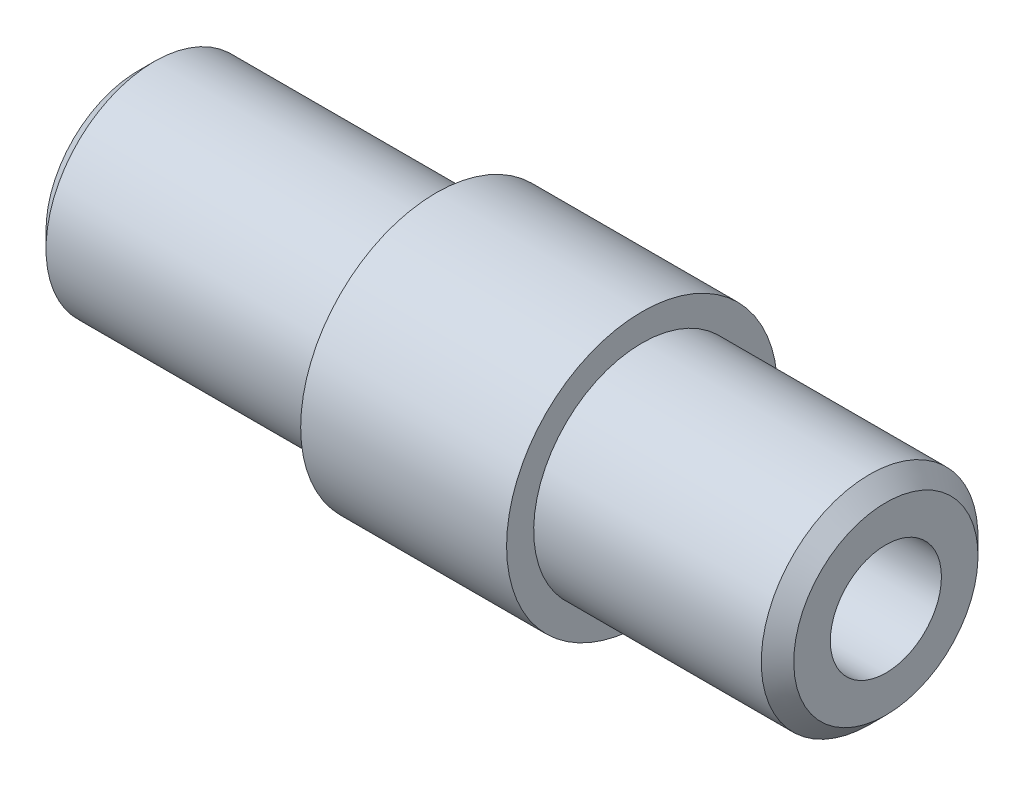
ISO-10303-21;
HEADER;
FILE_DESCRIPTION(('STEP AP214'),'2;1');
FILE_NAME('part.step','',(''),(''),'','','');
FILE_SCHEMA(('AUTOMOTIVE_DESIGN { 1 0 10303 214 1 1 1 1 }'));
ENDSEC;
DATA;
#1=APPLICATION_CONTEXT('core data for automotive mechanical design processes');
#2=APPLICATION_PROTOCOL_DEFINITION('international standard','automotive_design',2000,#1);
#3=PRODUCT_CONTEXT('',#1,'mechanical');
#4=PRODUCT('Part','Part','',(#3));
#5=PRODUCT_RELATED_PRODUCT_CATEGORY('part','',(#4));
#6=PRODUCT_DEFINITION_FORMATION('','',#4);
#7=PRODUCT_DEFINITION_CONTEXT('part definition',#1,'design');
#8=PRODUCT_DEFINITION('design','',#6,#7);
#9=PRODUCT_DEFINITION_SHAPE('','',#8);
#10=(LENGTH_UNIT() NAMED_UNIT(*) SI_UNIT(.MILLI.,.METRE.));
#11=(NAMED_UNIT(*) PLANE_ANGLE_UNIT() SI_UNIT($,.RADIAN.));
#12=(NAMED_UNIT(*) SI_UNIT($,.STERADIAN.) SOLID_ANGLE_UNIT());
#13=UNCERTAINTY_MEASURE_WITH_UNIT(LENGTH_MEASURE(1.E-05),#10,'distance_accuracy_value','');
#14=(GEOMETRIC_REPRESENTATION_CONTEXT(3) GLOBAL_UNCERTAINTY_ASSIGNED_CONTEXT((#13)) GLOBAL_UNIT_ASSIGNED_CONTEXT((#10,
#11,#12)) REPRESENTATION_CONTEXT('',''));
#15=CARTESIAN_POINT('',(0.,0.,0.));
#16=DIRECTION('',(0.,0.,1.));
#17=DIRECTION('',(1.,0.,0.));
#18=AXIS2_PLACEMENT_3D('',#15,#16,#17);
#19=CARTESIAN_POINT('',(13.8,0.,0.));
#20=DIRECTION('',(1.,0.,0.));
#21=DIRECTION('',(0.,1.,0.));
#22=AXIS2_PLACEMENT_3D('',#19,#20,#21);
#23=PLANE('',#22);
#24=CARTESIAN_POINT('',(13.8,0.,0.));
#25=DIRECTION('',(1.,0.,0.));
#26=DIRECTION('',(0.,1.,0.));
#27=AXIS2_PLACEMENT_3D('',#24,#25,#26);
#28=CIRCLE('',#27,1.69999999999999);
#29=CARTESIAN_POINT('',(13.8,-1.69999999999999,0.));
#30=VERTEX_POINT('',#29);
#31=EDGE_CURVE('E51',#30,#30,#28,.T.);
#32=ORIENTED_EDGE('',*,*,#31,.T.);
#33=EDGE_LOOP('',(#32));
#34=FACE_BOUND('',#33,.T.);
#35=CARTESIAN_POINT('',(13.8,0.,0.));
#36=DIRECTION('',(1.,0.,0.));
#37=DIRECTION('',(0.,0.,-1.));
#38=AXIS2_PLACEMENT_3D('',#35,#36,#37);
#39=CIRCLE('',#38,1.02499999999999);
#40=CARTESIAN_POINT('',(13.8,0.,-1.02499999999999));
#41=VERTEX_POINT('',#40);
#42=EDGE_CURVE('E71',#41,#41,#39,.T.);
#43=ORIENTED_EDGE('',*,*,#42,.F.);
#44=EDGE_LOOP('',(#43));
#45=FACE_BOUND('',#44,.T.);
#46=ADVANCED_FACE('F36',(#34,#45),#23,.T.);
#47=CARTESIAN_POINT('',(13.8,0.,0.));
#48=DIRECTION('',(1.,0.,0.));
#49=DIRECTION('',(0.,1.,0.));
#50=AXIS2_PLACEMENT_3D('',#47,#48,#49);
#51=CYLINDRICAL_SURFACE('',#50,2.);
#52=CARTESIAN_POINT('',(13.5,0.,0.));
#53=DIRECTION('',(1.,0.,0.));
#54=DIRECTION('',(0.,1.,0.));
#55=AXIS2_PLACEMENT_3D('',#52,#53,#54);
#56=CIRCLE('',#55,2.);
#57=CARTESIAN_POINT('',(13.5,-1.99999999999999,0.));
#58=VERTEX_POINT('',#57);
#59=EDGE_CURVE('E47',#58,#58,#56,.F.);
#60=ORIENTED_EDGE('',*,*,#59,.T.);
#61=EDGE_LOOP('',(#60));
#62=FACE_BOUND('',#61,.T.);
#63=CARTESIAN_POINT('',(9.3,0.,0.));
#64=DIRECTION('',(1.,0.,0.));
#65=DIRECTION('',(0.,1.,0.));
#66=AXIS2_PLACEMENT_3D('',#63,#64,#65);
#67=CIRCLE('',#66,2.);
#68=CARTESIAN_POINT('',(9.3,2.,0.));
#69=VERTEX_POINT('',#68);
#70=EDGE_CURVE('E56',#69,#69,#67,.T.);
#71=ORIENTED_EDGE('',*,*,#70,.T.);
#72=EDGE_LOOP('',(#71));
#73=FACE_BOUND('',#72,.T.);
#74=ADVANCED_FACE('F78',(#62,#73),#51,.T.);
#75=CARTESIAN_POINT('',(9.3,2.5,0.));
#76=DIRECTION('',(1.,0.,0.));
#77=DIRECTION('',(0.,1.,0.));
#78=AXIS2_PLACEMENT_3D('',#75,#76,#77);
#79=PLANE('',#78);
#80=CARTESIAN_POINT('',(9.3,0.,0.));
#81=DIRECTION('',(1.,0.,0.));
#82=DIRECTION('',(0.,1.,0.));
#83=AXIS2_PLACEMENT_3D('',#80,#81,#82);
#84=CIRCLE('',#83,2.5);
#85=CARTESIAN_POINT('',(9.3,2.5,0.));
#86=VERTEX_POINT('',#85);
#87=EDGE_CURVE('E59',#86,#86,#84,.T.);
#88=ORIENTED_EDGE('',*,*,#87,.T.);
#89=EDGE_LOOP('',(#88));
#90=FACE_BOUND('',#89,.T.);
#91=ORIENTED_EDGE('',*,*,#70,.F.);
#92=EDGE_LOOP('',(#91));
#93=FACE_BOUND('',#92,.T.);
#94=ADVANCED_FACE('F84',(#90,#93),#79,.T.);
#95=CARTESIAN_POINT('',(13.8,0.,0.));
#96=DIRECTION('',(1.,0.,0.));
#97=DIRECTION('',(0.,1.,0.));
#98=AXIS2_PLACEMENT_3D('',#95,#96,#97);
#99=CYLINDRICAL_SURFACE('',#98,2.5);
#100=CARTESIAN_POINT('',(5.5,0.,0.));
#101=DIRECTION('',(1.,0.,0.));
#102=DIRECTION('',(0.,1.,0.));
#103=AXIS2_PLACEMENT_3D('',#100,#101,#102);
#104=CIRCLE('',#103,2.5);
#105=CARTESIAN_POINT('',(5.5,2.5,0.));
#106=VERTEX_POINT('',#105);
#107=EDGE_CURVE('E62',#106,#106,#104,.T.);
#108=ORIENTED_EDGE('',*,*,#107,.T.);
#109=EDGE_LOOP('',(#108));
#110=FACE_BOUND('',#109,.T.);
#111=ORIENTED_EDGE('',*,*,#87,.F.);
#112=EDGE_LOOP('',(#111));
#113=FACE_BOUND('',#112,.T.);
#114=ADVANCED_FACE('F106',(#110,#113),#99,.T.);
#115=CARTESIAN_POINT('',(5.5,2.,0.));
#116=DIRECTION('',(-1.,0.,0.));
#117=DIRECTION('',(0.,-1.,0.));
#118=AXIS2_PLACEMENT_3D('',#115,#116,#117);
#119=PLANE('',#118);
#120=CARTESIAN_POINT('',(5.5,0.,0.));
#121=DIRECTION('',(1.,0.,0.));
#122=DIRECTION('',(0.,1.,0.));
#123=AXIS2_PLACEMENT_3D('',#120,#121,#122);
#124=CIRCLE('',#123,2.);
#125=CARTESIAN_POINT('',(5.5,2.,0.));
#126=VERTEX_POINT('',#125);
#127=EDGE_CURVE('E65',#126,#126,#124,.T.);
#128=ORIENTED_EDGE('',*,*,#127,.T.);
#129=EDGE_LOOP('',(#128));
#130=FACE_BOUND('',#129,.T.);
#131=ORIENTED_EDGE('',*,*,#107,.F.);
#132=EDGE_LOOP('',(#131));
#133=FACE_BOUND('',#132,.T.);
#134=ADVANCED_FACE('F111',(#130,#133),#119,.T.);
#135=CARTESIAN_POINT('',(13.8,0.,0.));
#136=DIRECTION('',(1.,0.,0.));
#137=DIRECTION('',(0.,1.,0.));
#138=AXIS2_PLACEMENT_3D('',#135,#136,#137);
#139=CYLINDRICAL_SURFACE('',#138,2.);
#140=CARTESIAN_POINT('',(0.3,0.,0.));
#141=DIRECTION('',(-1.,0.,0.));
#142=DIRECTION('',(0.,-1.,0.));
#143=AXIS2_PLACEMENT_3D('',#140,#141,#142);
#144=CIRCLE('',#143,2.);
#145=CARTESIAN_POINT('',(0.3,-2.,0.));
#146=VERTEX_POINT('',#145);
#147=EDGE_CURVE('E43',#146,#146,#144,.F.);
#148=ORIENTED_EDGE('',*,*,#147,.T.);
#149=EDGE_LOOP('',(#148));
#150=FACE_BOUND('',#149,.T.);
#151=ORIENTED_EDGE('',*,*,#127,.F.);
#152=EDGE_LOOP('',(#151));
#153=FACE_BOUND('',#152,.T.);
#154=ADVANCED_FACE('F117',(#150,#153),#139,.T.);
#155=CARTESIAN_POINT('',(0.,0.,0.));
#156=DIRECTION('',(-1.,0.,0.));
#157=DIRECTION('',(0.,-1.,0.));
#158=AXIS2_PLACEMENT_3D('',#155,#156,#157);
#159=PLANE('',#158);
#160=CARTESIAN_POINT('',(0.,0.,0.));
#161=DIRECTION('',(-1.,0.,0.));
#162=DIRECTION('',(0.,-1.,0.));
#163=AXIS2_PLACEMENT_3D('',#160,#161,#162);
#164=CIRCLE('',#163,1.7);
#165=CARTESIAN_POINT('',(0.,-1.7,0.));
#166=VERTEX_POINT('',#165);
#167=EDGE_CURVE('E10',#166,#166,#164,.T.);
#168=ORIENTED_EDGE('',*,*,#167,.T.);
#169=EDGE_LOOP('',(#168));
#170=FACE_BOUND('',#169,.T.);
#171=CARTESIAN_POINT('',(0.,0.,0.));
#172=DIRECTION('',(-1.,0.,0.));
#173=DIRECTION('',(0.,0.,1.));
#174=AXIS2_PLACEMENT_3D('',#171,#172,#173);
#175=CIRCLE('',#174,1.025);
#176=CARTESIAN_POINT('',(0.,0.,1.025));
#177=VERTEX_POINT('',#176);
#178=EDGE_CURVE('E68',#177,#177,#175,.T.);
#179=ORIENTED_EDGE('',*,*,#178,.F.);
#180=EDGE_LOOP('',(#179));
#181=FACE_BOUND('',#180,.T.);
#182=ADVANCED_FACE('F96',(#170,#181),#159,.T.);
#183=CARTESIAN_POINT('',(0.,0.,0.));
#184=DIRECTION('',(-1.,0.,0.));
#185=DIRECTION('',(0.,0.,1.));
#186=AXIS2_PLACEMENT_3D('',#183,#184,#185);
#187=CYLINDRICAL_SURFACE('',#186,1.025);
#188=ORIENTED_EDGE('',*,*,#178,.T.);
#189=EDGE_LOOP('',(#188));
#190=FACE_BOUND('',#189,.T.);
#191=ORIENTED_EDGE('',*,*,#42,.T.);
#192=EDGE_LOOP('',(#191));
#193=FACE_BOUND('',#192,.T.);
#194=ADVANCED_FACE('F75',(#190,#193),#187,.F.);
#195=CARTESIAN_POINT('',(13.8,0.,0.));
#196=DIRECTION('',(-1.,0.,0.));
#197=DIRECTION('',(0.,-1.,0.));
#198=AXIS2_PLACEMENT_3D('',#195,#196,#197);
#199=CONICAL_SURFACE('',#198,1.69999999999999,0.785398163397446);
#200=CARTESIAN_POINT('',(13.5,-1.99999999999999,0.));
#201=CARTESIAN_POINT('',(13.503125,-1.99687499999999,0.));
#202=CARTESIAN_POINT('',(13.50625,-1.99374999999999,0.));
#203=CARTESIAN_POINT('',(13.5125,-1.98749999999999,0.));
#204=CARTESIAN_POINT('',(13.515625,-1.98437499999999,0.));
#205=CARTESIAN_POINT('',(13.521875,-1.97812499999999,0.));
#206=CARTESIAN_POINT('',(13.525,-1.97499999999999,0.));
#207=CARTESIAN_POINT('',(13.53125,-1.96874999999999,0.));
#208=CARTESIAN_POINT('',(13.534375,-1.96562499999999,0.));
#209=CARTESIAN_POINT('',(13.540625,-1.95937499999999,0.));
#210=CARTESIAN_POINT('',(13.54375,-1.95624999999999,0.));
#211=CARTESIAN_POINT('',(13.55,-1.94999999999999,0.));
#212=CARTESIAN_POINT('',(13.553125,-1.94687499999999,0.));
#213=CARTESIAN_POINT('',(13.559375,-1.94062499999999,0.));
#214=CARTESIAN_POINT('',(13.5625,-1.93749999999999,0.));
#215=CARTESIAN_POINT('',(13.56875,-1.93124999999999,0.));
#216=CARTESIAN_POINT('',(13.571875,-1.92812499999999,0.));
#217=CARTESIAN_POINT('',(13.578125,-1.92187499999999,0.));
#218=CARTESIAN_POINT('',(13.58125,-1.91874999999999,0.));
#219=CARTESIAN_POINT('',(13.5875,-1.91249999999999,0.));
#220=CARTESIAN_POINT('',(13.590625,-1.90937499999999,0.));
#221=CARTESIAN_POINT('',(13.596875,-1.90312499999999,0.));
#222=CARTESIAN_POINT('',(13.6,-1.89999999999999,0.));
#223=CARTESIAN_POINT('',(13.60625,-1.89374999999999,0.));
#224=CARTESIAN_POINT('',(13.609375,-1.89062499999999,0.));
#225=CARTESIAN_POINT('',(13.615625,-1.88437499999999,0.));
#226=CARTESIAN_POINT('',(13.61875,-1.88124999999999,0.));
#227=CARTESIAN_POINT('',(13.625,-1.87499999999999,0.));
#228=CARTESIAN_POINT('',(13.628125,-1.87187499999999,0.));
#229=CARTESIAN_POINT('',(13.634375,-1.86562499999999,0.));
#230=CARTESIAN_POINT('',(13.6375,-1.86249999999999,0.));
#231=CARTESIAN_POINT('',(13.64375,-1.85624999999999,0.));
#232=CARTESIAN_POINT('',(13.646875,-1.85312499999999,0.));
#233=CARTESIAN_POINT('',(13.653125,-1.84687499999999,0.));
#234=CARTESIAN_POINT('',(13.65625,-1.84374999999999,0.));
#235=CARTESIAN_POINT('',(13.6625,-1.83749999999999,0.));
#236=CARTESIAN_POINT('',(13.665625,-1.83437499999999,0.));
#237=CARTESIAN_POINT('',(13.671875,-1.82812499999999,0.));
#238=CARTESIAN_POINT('',(13.675,-1.82499999999999,0.));
#239=CARTESIAN_POINT('',(13.68125,-1.81874999999999,0.));
#240=CARTESIAN_POINT('',(13.684375,-1.81562499999999,0.));
#241=CARTESIAN_POINT('',(13.690625,-1.80937499999999,0.));
#242=CARTESIAN_POINT('',(13.69375,-1.80624999999999,0.));
#243=CARTESIAN_POINT('',(13.7,-1.79999999999999,0.));
#244=CARTESIAN_POINT('',(13.703125,-1.79687499999999,0.));
#245=CARTESIAN_POINT('',(13.709375,-1.79062499999999,0.));
#246=CARTESIAN_POINT('',(13.7125,-1.78749999999999,0.));
#247=CARTESIAN_POINT('',(13.71875,-1.78124999999999,0.));
#248=CARTESIAN_POINT('',(13.721875,-1.77812499999999,0.));
#249=CARTESIAN_POINT('',(13.728125,-1.77187499999999,0.));
#250=CARTESIAN_POINT('',(13.73125,-1.76874999999999,0.));
#251=CARTESIAN_POINT('',(13.7375,-1.76249999999999,0.));
#252=CARTESIAN_POINT('',(13.740625,-1.75937499999999,0.));
#253=CARTESIAN_POINT('',(13.746875,-1.75312499999999,0.));
#254=CARTESIAN_POINT('',(13.75,-1.74999999999999,0.));
#255=CARTESIAN_POINT('',(13.75625,-1.74374999999999,0.));
#256=CARTESIAN_POINT('',(13.759375,-1.74062499999999,0.));
#257=CARTESIAN_POINT('',(13.765625,-1.73437499999999,0.));
#258=CARTESIAN_POINT('',(13.76875,-1.73124999999999,0.));
#259=CARTESIAN_POINT('',(13.775,-1.72499999999999,0.));
#260=CARTESIAN_POINT('',(13.778125,-1.72187499999999,0.));
#261=CARTESIAN_POINT('',(13.784375,-1.71562499999999,0.));
#262=CARTESIAN_POINT('',(13.7875,-1.71249999999999,0.));
#263=CARTESIAN_POINT('',(13.79375,-1.70624999999999,0.));
#264=CARTESIAN_POINT('',(13.796875,-1.70312499999999,0.));
#265=CARTESIAN_POINT('',(13.8,-1.69999999999999,0.));
#266=B_SPLINE_CURVE_WITH_KNOTS('',3,(#200,#201,#202,#203,#204,#205,#206,#207,#208,#209,#210,
#211,#212,#213,#214,#215,#216,#217,#218,#219,#220,#221,#222,#223,#224,#225,#226,#227,#228,#229,
#230,#231,#232,#233,#234,#235,#236,#237,#238,#239,#240,#241,#242,#243,#244,#245,#246,#247,#248,
#249,#250,#251,#252,#253,#254,#255,#256,#257,#258,#259,#260,#261,#262,#263,#264,#265),
.UNSPECIFIED.,.F.,.F.,(4,2,2,2,2,2,2,2,2,2,2,2,2,2,2,2,2,2,2,2,2,2,2,2,2,2,2,2,2,2,2,2,4),(0.,
0.0132582521472472,0.0265165042944954,0.0397747564417438,0.0530330085889907,0.0662912607362394,
0.0795495128834878,0.0928077650307349,0.106066017177983,0.119324269325232,0.132582521472479,
0.145840773619727,0.159099025766975,0.172357277914223,0.185615530061471,0.198873782208719,
0.212132034355968,0.225390286503215,0.238648538650463,0.251906790797711,0.265165042944959,
0.278423295092207,0.291681547239455,0.304939799386702,0.318198051533951,0.331456303681199,
0.344714555828446,0.357972807975694,0.371231060122943,0.38448931227019,0.397747564417438,
0.411005816564687,0.424264068711934),.UNSPECIFIED.);
#267=EDGE_CURVE('BSEAM88',#58,#30,#266,.T.);
#268=ORIENTED_EDGE('',*,*,#59,.F.);
#269=ORIENTED_EDGE('',*,*,#31,.F.);
#270=ORIENTED_EDGE('',*,*,#267,.T.);
#271=ORIENTED_EDGE('',*,*,#267,.F.);
#272=EDGE_LOOP('',(#268,#270,#269,#271));
#273=FACE_BOUND('',#272,.T.);
#274=ADVANCED_FACE('F88',(#273),#199,.T.);
#275=CARTESIAN_POINT('',(0.3,0.,0.));
#276=DIRECTION('',(1.,0.,0.));
#277=DIRECTION('',(0.,1.,0.));
#278=AXIS2_PLACEMENT_3D('',#275,#276,#277);
#279=CONICAL_SURFACE('',#278,2.,0.785398163397449);
#280=ORIENTED_EDGE('',*,*,#167,.F.);
#281=EDGE_LOOP('',(#280));
#282=FACE_BOUND('',#281,.T.);
#283=ORIENTED_EDGE('',*,*,#147,.F.);
#284=EDGE_LOOP('',(#283));
#285=FACE_BOUND('',#284,.T.);
#286=ADVANCED_FACE('F38',(#282,#285),#279,.T.);
#287=CLOSED_SHELL('',(#46,#74,#94,#114,#134,#154,#182,#194,#274,#286));
#288=MANIFOLD_SOLID_BREP('B2',#287);
#289=ADVANCED_BREP_SHAPE_REPRESENTATION('',(#18,#288),#14);
#290=SHAPE_DEFINITION_REPRESENTATION(#9,#289);
ENDSEC;
END-ISO-10303-21;
